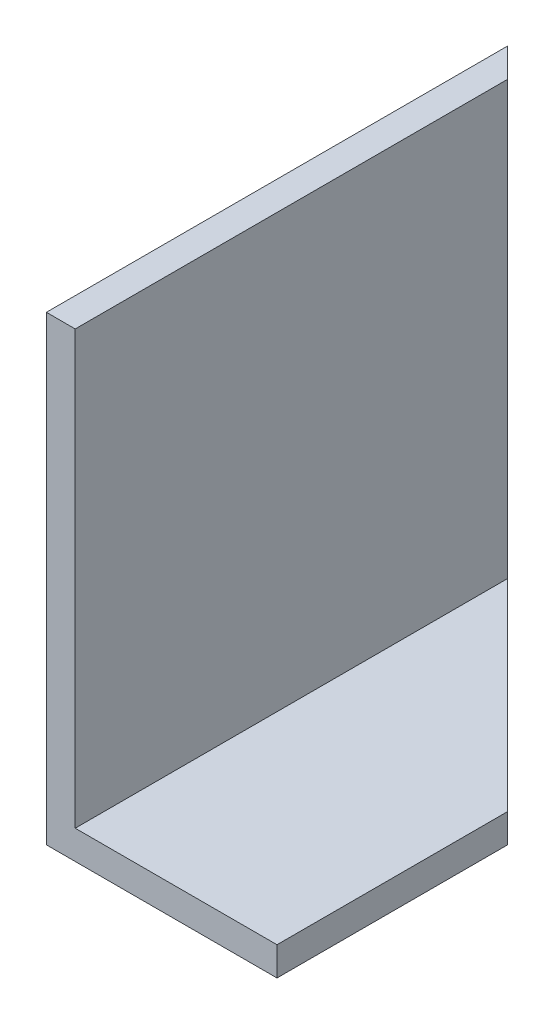
ISO-10303-21;
HEADER;
FILE_DESCRIPTION(('STEP AP214'),'2;1');
FILE_NAME('part.step','',(''),(''),'','','');
FILE_SCHEMA(('AUTOMOTIVE_DESIGN { 1 0 10303 214 1 1 1 1 }'));
ENDSEC;
DATA;
#1=APPLICATION_CONTEXT('core data for automotive mechanical design processes');
#2=APPLICATION_PROTOCOL_DEFINITION('international standard','automotive_design',2000,#1);
#3=PRODUCT_CONTEXT('',#1,'mechanical');
#4=PRODUCT('Part','Part','',(#3));
#5=PRODUCT_RELATED_PRODUCT_CATEGORY('part','',(#4));
#6=PRODUCT_DEFINITION_FORMATION('','',#4);
#7=PRODUCT_DEFINITION_CONTEXT('part definition',#1,'design');
#8=PRODUCT_DEFINITION('design','',#6,#7);
#9=PRODUCT_DEFINITION_SHAPE('','',#8);
#10=(LENGTH_UNIT() NAMED_UNIT(*) SI_UNIT(.MILLI.,.METRE.));
#11=(NAMED_UNIT(*) PLANE_ANGLE_UNIT() SI_UNIT($,.RADIAN.));
#12=(NAMED_UNIT(*) SI_UNIT($,.STERADIAN.) SOLID_ANGLE_UNIT());
#13=UNCERTAINTY_MEASURE_WITH_UNIT(LENGTH_MEASURE(1.E-05),#10,'distance_accuracy_value','');
#14=(GEOMETRIC_REPRESENTATION_CONTEXT(3) GLOBAL_UNCERTAINTY_ASSIGNED_CONTEXT((#13)) GLOBAL_UNIT_ASSIGNED_CONTEXT((#10,
#11,#12)) REPRESENTATION_CONTEXT('',''));
#15=CARTESIAN_POINT('',(0.,0.,0.));
#16=DIRECTION('',(0.,0.,1.));
#17=DIRECTION('',(1.,0.,0.));
#18=AXIS2_PLACEMENT_3D('',#15,#16,#17);
#19=CARTESIAN_POINT('',(-9.525,-22.225,50.8));
#20=DIRECTION('',(-1.,0.,0.));
#21=DIRECTION('',(0.,0.,1.));
#22=AXIS2_PLACEMENT_3D('',#19,#20,#21);
#23=PLANE('',#22);
#24=DIRECTION('',(0.,0.,-1.));
#25=VECTOR('',#24,1.);
#26=CARTESIAN_POINT('',(-9.525,-22.225,50.8));
#27=LINE('',#26,#25);
#28=CARTESIAN_POINT('',(-9.525,-22.225,50.8));
#29=VERTEX_POINT('',#28);
#30=CARTESIAN_POINT('',(-9.525,-22.225,3.17499999999995));
#31=VERTEX_POINT('',#30);
#32=EDGE_CURVE('E112',#29,#31,#27,.T.);
#33=ORIENTED_EDGE('',*,*,#32,.T.);
#34=DIRECTION('',(0.,1.,0.));
#35=VECTOR('',#34,1.);
#36=CARTESIAN_POINT('',(-9.525,-22.225,3.17499999999996));
#37=LINE('',#36,#35);
#38=CARTESIAN_POINT('',(-9.525,25.4,3.17499999999996));
#39=VERTEX_POINT('',#38);
#40=EDGE_CURVE('E92',#31,#39,#37,.T.);
#41=ORIENTED_EDGE('',*,*,#40,.T.);
#42=DIRECTION('',(0.,0.,-1.));
#43=VECTOR('',#42,1.);
#44=CARTESIAN_POINT('',(-9.525,25.4,50.8));
#45=LINE('',#44,#43);
#46=CARTESIAN_POINT('',(-9.525,25.4,50.8));
#47=VERTEX_POINT('',#46);
#48=EDGE_CURVE('E11',#47,#39,#45,.T.);
#49=ORIENTED_EDGE('',*,*,#48,.F.);
#50=DIRECTION('',(0.,1.,0.));
#51=VECTOR('',#50,1.);
#52=CARTESIAN_POINT('',(-9.525,-22.225,50.8));
#53=LINE('',#52,#51);
#54=EDGE_CURVE('E91',#29,#47,#53,.T.);
#55=ORIENTED_EDGE('',*,*,#54,.F.);
#56=EDGE_LOOP('',(#33,#41,#49,#55));
#57=FACE_BOUND('',#56,.T.);
#58=ADVANCED_FACE('F32',(#57),#23,.F.);
#59=CARTESIAN_POINT('',(-12.7,25.4,50.8));
#60=DIRECTION('',(0.,-1.,0.));
#61=DIRECTION('',(0.,0.,-1.));
#62=AXIS2_PLACEMENT_3D('',#59,#60,#61);
#63=PLANE('',#62);
#64=ORIENTED_EDGE('',*,*,#48,.T.);
#65=DIRECTION('',(-0.707106781186551,0.,-0.707106781186544));
#66=VECTOR('',#65,1.);
#67=CARTESIAN_POINT('',(-12.7,25.4,0.));
#68=LINE('',#67,#66);
#69=CARTESIAN_POINT('',(-12.7,25.4,0.));
#70=VERTEX_POINT('',#69);
#71=EDGE_CURVE('E83',#39,#70,#68,.T.);
#72=ORIENTED_EDGE('',*,*,#71,.T.);
#73=DIRECTION('',(0.,0.,-1.));
#74=VECTOR('',#73,1.);
#75=CARTESIAN_POINT('',(-12.7,25.4,50.8));
#76=LINE('',#75,#74);
#77=CARTESIAN_POINT('',(-12.7,25.4,50.8));
#78=VERTEX_POINT('',#77);
#79=EDGE_CURVE('E40',#78,#70,#76,.T.);
#80=ORIENTED_EDGE('',*,*,#79,.F.);
#81=DIRECTION('',(-1.,0.,0.));
#82=VECTOR('',#81,1.);
#83=CARTESIAN_POINT('',(-12.7,25.4,50.8));
#84=LINE('',#83,#82);
#85=EDGE_CURVE('E121',#47,#78,#84,.T.);
#86=ORIENTED_EDGE('',*,*,#85,.F.);
#87=EDGE_LOOP('',(#64,#72,#80,#86));
#88=FACE_BOUND('',#87,.T.);
#89=ADVANCED_FACE('F96',(#88),#63,.F.);
#90=CARTESIAN_POINT('',(-12.7,-25.4,50.8));
#91=DIRECTION('',(1.,0.,0.));
#92=DIRECTION('',(0.,0.,-1.));
#93=AXIS2_PLACEMENT_3D('',#90,#91,#92);
#94=PLANE('',#93);
#95=DIRECTION('',(0.,-1.,0.));
#96=VECTOR('',#95,1.);
#97=CARTESIAN_POINT('',(-12.7,-25.4,0.));
#98=LINE('',#97,#96);
#99=CARTESIAN_POINT('',(-12.7,-25.4,0.));
#100=VERTEX_POINT('',#99);
#101=EDGE_CURVE('E80',#70,#100,#98,.T.);
#102=ORIENTED_EDGE('',*,*,#101,.T.);
#103=DIRECTION('',(0.,0.,-1.));
#104=VECTOR('',#103,1.);
#105=CARTESIAN_POINT('',(-12.7,-25.4,50.8));
#106=LINE('',#105,#104);
#107=CARTESIAN_POINT('',(-12.7,-25.4,50.8));
#108=VERTEX_POINT('',#107);
#109=EDGE_CURVE('E103',#108,#100,#106,.T.);
#110=ORIENTED_EDGE('',*,*,#109,.F.);
#111=DIRECTION('',(0.,-1.,0.));
#112=VECTOR('',#111,1.);
#113=CARTESIAN_POINT('',(-12.7,-25.4,50.8));
#114=LINE('',#113,#112);
#115=EDGE_CURVE('E102',#78,#108,#114,.T.);
#116=ORIENTED_EDGE('',*,*,#115,.F.);
#117=ORIENTED_EDGE('',*,*,#79,.T.);
#118=EDGE_LOOP('',(#102,#110,#116,#117));
#119=FACE_BOUND('',#118,.T.);
#120=ADVANCED_FACE('F101',(#119),#94,.F.);
#121=CARTESIAN_POINT('',(-12.7,-25.4,50.8));
#122=DIRECTION('',(0.,1.,0.));
#123=DIRECTION('',(0.,0.,1.));
#124=AXIS2_PLACEMENT_3D('',#121,#122,#123);
#125=PLANE('',#124);
#126=ORIENTED_EDGE('',*,*,#109,.T.);
#127=DIRECTION('',(-0.707106781186551,0.,-0.707106781186544));
#128=VECTOR('',#127,1.);
#129=CARTESIAN_POINT('',(-12.7,-25.4,0.));
#130=LINE('',#129,#128);
#131=CARTESIAN_POINT('',(12.7,-25.4,25.3999999999997));
#132=VERTEX_POINT('',#131);
#133=EDGE_CURVE('E86',#132,#100,#130,.T.);
#134=ORIENTED_EDGE('',*,*,#133,.F.);
#135=DIRECTION('',(0.,0.,-1.));
#136=VECTOR('',#135,1.);
#137=CARTESIAN_POINT('',(12.7,-25.4,50.8));
#138=LINE('',#137,#136);
#139=CARTESIAN_POINT('',(12.7,-25.4,50.8));
#140=VERTEX_POINT('',#139);
#141=EDGE_CURVE('E104',#140,#132,#138,.T.);
#142=ORIENTED_EDGE('',*,*,#141,.F.);
#143=DIRECTION('',(1.,0.,0.));
#144=VECTOR('',#143,1.);
#145=CARTESIAN_POINT('',(-12.7,-25.4,50.8));
#146=LINE('',#145,#144);
#147=EDGE_CURVE('E118',#108,#140,#146,.T.);
#148=ORIENTED_EDGE('',*,*,#147,.F.);
#149=EDGE_LOOP('',(#126,#134,#142,#148));
#150=FACE_BOUND('',#149,.T.);
#151=ADVANCED_FACE('F134',(#150),#125,.F.);
#152=CARTESIAN_POINT('',(12.7,-25.4,50.8));
#153=DIRECTION('',(-1.,0.,0.));
#154=DIRECTION('',(0.,0.,1.));
#155=AXIS2_PLACEMENT_3D('',#152,#153,#154);
#156=PLANE('',#155);
#157=ORIENTED_EDGE('',*,*,#141,.T.);
#158=DIRECTION('',(0.,-1.,0.));
#159=VECTOR('',#158,1.);
#160=CARTESIAN_POINT('',(12.7,25.4,25.3999999999997));
#161=LINE('',#160,#159);
#162=CARTESIAN_POINT('',(12.7,-22.225,25.3999999999997));
#163=VERTEX_POINT('',#162);
#164=EDGE_CURVE('E99',#163,#132,#161,.T.);
#165=ORIENTED_EDGE('',*,*,#164,.F.);
#166=DIRECTION('',(0.,0.,-1.));
#167=VECTOR('',#166,1.);
#168=CARTESIAN_POINT('',(12.7,-22.225,50.8));
#169=LINE('',#168,#167);
#170=CARTESIAN_POINT('',(12.7,-22.225,50.8));
#171=VERTEX_POINT('',#170);
#172=EDGE_CURVE('E109',#171,#163,#169,.T.);
#173=ORIENTED_EDGE('',*,*,#172,.F.);
#174=DIRECTION('',(0.,1.,0.));
#175=VECTOR('',#174,1.);
#176=CARTESIAN_POINT('',(12.7,-25.4,50.8));
#177=LINE('',#176,#175);
#178=EDGE_CURVE('E116',#140,#171,#177,.T.);
#179=ORIENTED_EDGE('',*,*,#178,.F.);
#180=EDGE_LOOP('',(#157,#165,#173,#179));
#181=FACE_BOUND('',#180,.T.);
#182=ADVANCED_FACE('F137',(#181),#156,.F.);
#183=CARTESIAN_POINT('',(-9.525,-22.225,50.8));
#184=DIRECTION('',(0.,-1.,0.));
#185=DIRECTION('',(0.,0.,-1.));
#186=AXIS2_PLACEMENT_3D('',#183,#184,#185);
#187=PLANE('',#186);
#188=ORIENTED_EDGE('',*,*,#172,.T.);
#189=DIRECTION('',(-0.707106781186551,0.,-0.707106781186544));
#190=VECTOR('',#189,1.);
#191=CARTESIAN_POINT('',(14.2875,-22.225,26.9874999999997));
#192=LINE('',#191,#190);
#193=EDGE_CURVE('E125',#163,#31,#192,.T.);
#194=ORIENTED_EDGE('',*,*,#193,.T.);
#195=ORIENTED_EDGE('',*,*,#32,.F.);
#196=DIRECTION('',(-1.,0.,0.));
#197=VECTOR('',#196,1.);
#198=CARTESIAN_POINT('',(-9.525,-22.225,50.8));
#199=LINE('',#198,#197);
#200=EDGE_CURVE('E47',#171,#29,#199,.T.);
#201=ORIENTED_EDGE('',*,*,#200,.F.);
#202=EDGE_LOOP('',(#188,#194,#195,#201));
#203=FACE_BOUND('',#202,.T.);
#204=ADVANCED_FACE('F142',(#203),#187,.F.);
#205=CARTESIAN_POINT('',(0.,0.,50.8));
#206=DIRECTION('',(0.,0.,-1.));
#207=DIRECTION('',(-1.,0.,0.));
#208=AXIS2_PLACEMENT_3D('',#205,#206,#207);
#209=PLANE('',#208);
#210=ORIENTED_EDGE('',*,*,#54,.T.);
#211=ORIENTED_EDGE('',*,*,#85,.T.);
#212=ORIENTED_EDGE('',*,*,#115,.T.);
#213=ORIENTED_EDGE('',*,*,#147,.T.);
#214=ORIENTED_EDGE('',*,*,#178,.T.);
#215=ORIENTED_EDGE('',*,*,#200,.T.);
#216=EDGE_LOOP('',(#210,#211,#212,#213,#214,#215));
#217=FACE_BOUND('',#216,.T.);
#218=ADVANCED_FACE('F138',(#217),#209,.F.);
#219=CARTESIAN_POINT('',(-12.7,25.4,0.));
#220=DIRECTION('',(-0.707106781186544,0.,0.707106781186551));
#221=DIRECTION('',(0.707106781186551,0.,0.707106781186544));
#222=AXIS2_PLACEMENT_3D('',#219,#220,#221);
#223=PLANE('',#222);
#224=ORIENTED_EDGE('',*,*,#193,.F.);
#225=ORIENTED_EDGE('',*,*,#164,.T.);
#226=ORIENTED_EDGE('',*,*,#133,.T.);
#227=ORIENTED_EDGE('',*,*,#101,.F.);
#228=ORIENTED_EDGE('',*,*,#71,.F.);
#229=ORIENTED_EDGE('',*,*,#40,.F.);
#230=EDGE_LOOP('',(#224,#225,#226,#227,#228,#229));
#231=FACE_BOUND('',#230,.T.);
#232=ADVANCED_FACE('F82',(#231),#223,.F.);
#233=CLOSED_SHELL('',(#58,#89,#120,#151,#182,#204,#218,#232));
#234=MANIFOLD_SOLID_BREP('B2',#233);
#235=ADVANCED_BREP_SHAPE_REPRESENTATION('',(#18,#234),#14);
#236=SHAPE_DEFINITION_REPRESENTATION(#9,#235);
ENDSEC;
END-ISO-10303-21;
